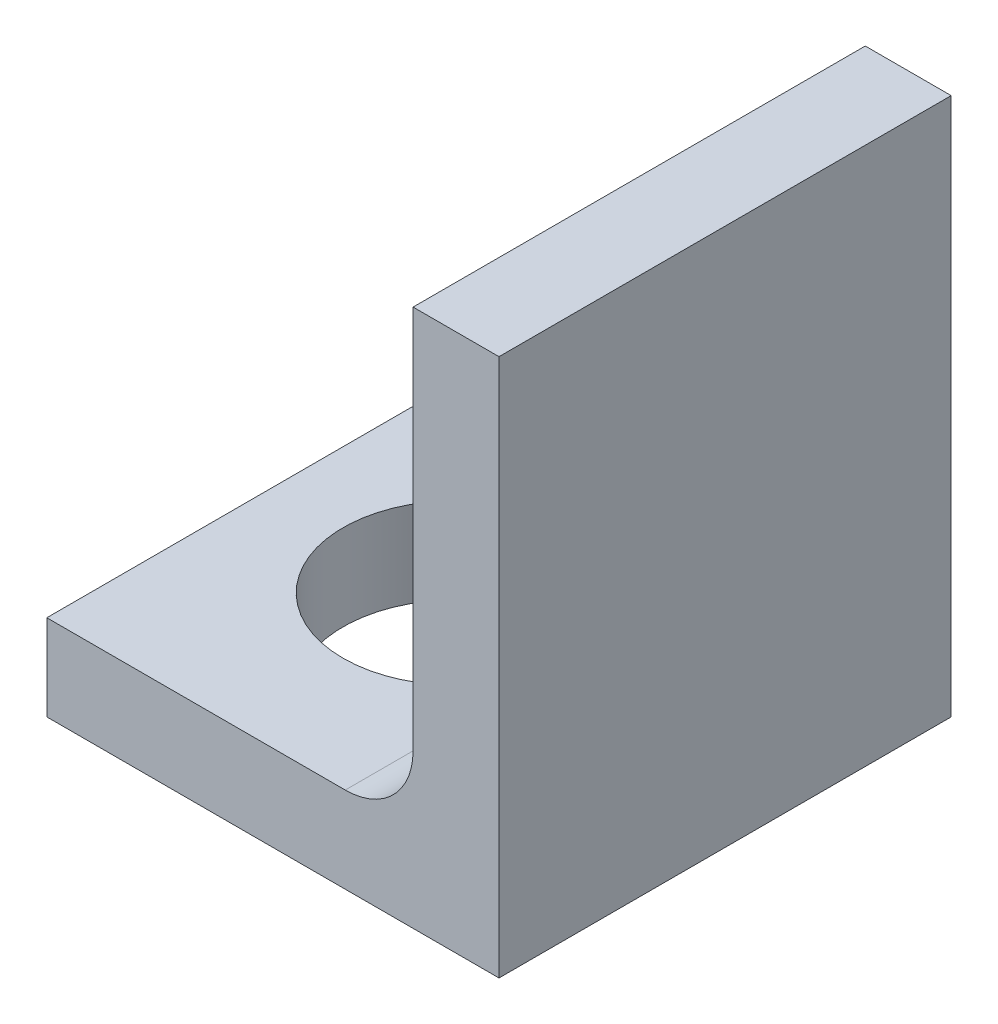
ISO-10303-21;
HEADER;
FILE_DESCRIPTION(('STEP AP214'),'2;1');
FILE_NAME('part.step','',(''),(''),'','','');
FILE_SCHEMA(('AUTOMOTIVE_DESIGN { 1 0 10303 214 1 1 1 1 }'));
ENDSEC;
DATA;
#1=APPLICATION_CONTEXT('core data for automotive mechanical design processes');
#2=APPLICATION_PROTOCOL_DEFINITION('international standard','automotive_design',2000,#1);
#3=PRODUCT_CONTEXT('',#1,'mechanical');
#4=PRODUCT('Part','Part','',(#3));
#5=PRODUCT_RELATED_PRODUCT_CATEGORY('part','',(#4));
#6=PRODUCT_DEFINITION_FORMATION('','',#4);
#7=PRODUCT_DEFINITION_CONTEXT('part definition',#1,'design');
#8=PRODUCT_DEFINITION('design','',#6,#7);
#9=PRODUCT_DEFINITION_SHAPE('','',#8);
#10=(LENGTH_UNIT() NAMED_UNIT(*) SI_UNIT(.MILLI.,.METRE.));
#11=(NAMED_UNIT(*) PLANE_ANGLE_UNIT() SI_UNIT($,.RADIAN.));
#12=(NAMED_UNIT(*) SI_UNIT($,.STERADIAN.) SOLID_ANGLE_UNIT());
#13=UNCERTAINTY_MEASURE_WITH_UNIT(LENGTH_MEASURE(1.E-05),#10,'distance_accuracy_value','');
#14=(GEOMETRIC_REPRESENTATION_CONTEXT(3) GLOBAL_UNCERTAINTY_ASSIGNED_CONTEXT((#13)) GLOBAL_UNIT_ASSIGNED_CONTEXT((#10,
#11,#12)) REPRESENTATION_CONTEXT('',''));
#15=CARTESIAN_POINT('',(0.,0.,0.));
#16=DIRECTION('',(0.,0.,1.));
#17=DIRECTION('',(1.,0.,0.));
#18=AXIS2_PLACEMENT_3D('',#15,#16,#17);
#19=CARTESIAN_POINT('',(0.,0.,20.));
#20=DIRECTION('',(0.,-1.,0.));
#21=DIRECTION('',(0.,0.,-1.));
#22=AXIS2_PLACEMENT_3D('',#19,#20,#21);
#23=PLANE('',#22);
#24=CARTESIAN_POINT('',(8.1,0.,10.));
#25=DIRECTION('',(0.,1.,0.));
#26=DIRECTION('',(0.,0.,1.));
#27=AXIS2_PLACEMENT_3D('',#24,#25,#26);
#28=CIRCLE('',#27,5.);
#29=CARTESIAN_POINT('',(8.1,0.,15.));
#30=VERTEX_POINT('',#29);
#31=EDGE_CURVE('E140',#30,#30,#28,.T.);
#32=ORIENTED_EDGE('',*,*,#31,.F.);
#33=EDGE_LOOP('',(#32));
#34=FACE_BOUND('',#33,.T.);
#35=DIRECTION('',(-1.,0.,0.));
#36=VECTOR('',#35,1.);
#37=CARTESIAN_POINT('',(0.,0.,20.));
#38=LINE('',#37,#36);
#39=CARTESIAN_POINT('',(13.2,0.,20.));
#40=VERTEX_POINT('',#39);
#41=CARTESIAN_POINT('',(0.,0.,20.));
#42=VERTEX_POINT('',#41);
#43=EDGE_CURVE('E161',#40,#42,#38,.T.);
#44=ORIENTED_EDGE('',*,*,#43,.F.);
#45=DIRECTION('',(0.,0.,1.));
#46=VECTOR('',#45,1.);
#47=CARTESIAN_POINT('',(13.2,0.,0.));
#48=LINE('',#47,#46);
#49=CARTESIAN_POINT('',(13.2,0.,0.));
#50=VERTEX_POINT('',#49);
#51=EDGE_CURVE('E70',#40,#50,#48,.F.);
#52=ORIENTED_EDGE('',*,*,#51,.T.);
#53=DIRECTION('',(-1.,0.,0.));
#54=VECTOR('',#53,1.);
#55=CARTESIAN_POINT('',(0.,0.,0.));
#56=LINE('',#55,#54);
#57=CARTESIAN_POINT('',(0.,0.,0.));
#58=VERTEX_POINT('',#57);
#59=EDGE_CURVE('E111',#50,#58,#56,.T.);
#60=ORIENTED_EDGE('',*,*,#59,.T.);
#61=DIRECTION('',(0.,0.,-1.));
#62=VECTOR('',#61,1.);
#63=CARTESIAN_POINT('',(0.,0.,20.));
#64=LINE('',#63,#62);
#65=EDGE_CURVE('E163',#42,#58,#64,.T.);
#66=ORIENTED_EDGE('',*,*,#65,.F.);
#67=EDGE_LOOP('',(#44,#52,#60,#66));
#68=FACE_BOUND('',#67,.T.);
#69=ADVANCED_FACE('F44',(#34,#68),#23,.F.);
#70=CARTESIAN_POINT('',(0.,0.,20.));
#71=DIRECTION('',(1.,0.,0.));
#72=DIRECTION('',(0.,1.,0.));
#73=AXIS2_PLACEMENT_3D('',#70,#71,#72);
#74=PLANE('',#73);
#75=DIRECTION('',(0.,-1.,0.));
#76=VECTOR('',#75,1.);
#77=CARTESIAN_POINT('',(0.,0.,0.));
#78=LINE('',#77,#76);
#79=CARTESIAN_POINT('',(0.,-3.8,0.));
#80=VERTEX_POINT('',#79);
#81=EDGE_CURVE('E147',#58,#80,#78,.T.);
#82=ORIENTED_EDGE('',*,*,#81,.T.);
#83=DIRECTION('',(0.,0.,-1.));
#84=VECTOR('',#83,1.);
#85=CARTESIAN_POINT('',(0.,-3.8,20.));
#86=LINE('',#85,#84);
#87=CARTESIAN_POINT('',(0.,-3.8,20.));
#88=VERTEX_POINT('',#87);
#89=EDGE_CURVE('E180',#88,#80,#86,.T.);
#90=ORIENTED_EDGE('',*,*,#89,.F.);
#91=DIRECTION('',(0.,-1.,0.));
#92=VECTOR('',#91,1.);
#93=CARTESIAN_POINT('',(0.,0.,20.));
#94=LINE('',#93,#92);
#95=EDGE_CURVE('E151',#42,#88,#94,.T.);
#96=ORIENTED_EDGE('',*,*,#95,.F.);
#97=ORIENTED_EDGE('',*,*,#65,.T.);
#98=EDGE_LOOP('',(#82,#90,#96,#97));
#99=FACE_BOUND('',#98,.T.);
#100=ADVANCED_FACE('F200',(#99),#74,.F.);
#101=CARTESIAN_POINT('',(0.,-3.8,20.));
#102=DIRECTION('',(0.,1.,0.));
#103=DIRECTION('',(0.,0.,1.));
#104=AXIS2_PLACEMENT_3D('',#101,#102,#103);
#105=PLANE('',#104);
#106=CARTESIAN_POINT('',(8.1,-3.8,10.));
#107=DIRECTION('',(0.,1.,0.));
#108=DIRECTION('',(0.,0.,1.));
#109=AXIS2_PLACEMENT_3D('',#106,#107,#108);
#110=CIRCLE('',#109,5.);
#111=CARTESIAN_POINT('',(8.1,-3.8,15.));
#112=VERTEX_POINT('',#111);
#113=EDGE_CURVE('E134',#112,#112,#110,.T.);
#114=ORIENTED_EDGE('',*,*,#113,.T.);
#115=EDGE_LOOP('',(#114));
#116=FACE_BOUND('',#115,.T.);
#117=DIRECTION('',(1.,0.,0.));
#118=VECTOR('',#117,1.);
#119=CARTESIAN_POINT('',(0.,-3.8,0.));
#120=LINE('',#119,#118);
#121=CARTESIAN_POINT('',(20.,-3.8,0.));
#122=VERTEX_POINT('',#121);
#123=EDGE_CURVE('E113',#80,#122,#120,.T.);
#124=ORIENTED_EDGE('',*,*,#123,.T.);
#125=DIRECTION('',(0.,0.,-1.));
#126=VECTOR('',#125,1.);
#127=CARTESIAN_POINT('',(20.,-3.8,20.));
#128=LINE('',#127,#126);
#129=CARTESIAN_POINT('',(20.,-3.8,20.));
#130=VERTEX_POINT('',#129);
#131=EDGE_CURVE('E112',#130,#122,#128,.T.);
#132=ORIENTED_EDGE('',*,*,#131,.F.);
#133=DIRECTION('',(1.,0.,0.));
#134=VECTOR('',#133,1.);
#135=CARTESIAN_POINT('',(0.,-3.8,20.));
#136=LINE('',#135,#134);
#137=EDGE_CURVE('E154',#88,#130,#136,.T.);
#138=ORIENTED_EDGE('',*,*,#137,.F.);
#139=ORIENTED_EDGE('',*,*,#89,.T.);
#140=EDGE_LOOP('',(#124,#132,#138,#139));
#141=FACE_BOUND('',#140,.T.);
#142=ADVANCED_FACE('F197',(#116,#141),#105,.F.);
#143=CARTESIAN_POINT('',(20.,0.,20.));
#144=DIRECTION('',(-1.,0.,0.));
#145=DIRECTION('',(0.,0.,1.));
#146=AXIS2_PLACEMENT_3D('',#143,#144,#145);
#147=PLANE('',#146);
#148=DIRECTION('',(0.,1.,0.));
#149=VECTOR('',#148,1.);
#150=CARTESIAN_POINT('',(20.,0.,0.));
#151=LINE('',#150,#149);
#152=CARTESIAN_POINT('',(20.,20.,0.));
#153=VERTEX_POINT('',#152);
#154=EDGE_CURVE('E102',#122,#153,#151,.T.);
#155=ORIENTED_EDGE('',*,*,#154,.T.);
#156=DIRECTION('',(0.,0.,-1.));
#157=VECTOR('',#156,1.);
#158=CARTESIAN_POINT('',(20.,20.,0.));
#159=LINE('',#158,#157);
#160=CARTESIAN_POINT('',(20.,20.,20.));
#161=VERTEX_POINT('',#160);
#162=EDGE_CURVE('E108',#161,#153,#159,.T.);
#163=ORIENTED_EDGE('',*,*,#162,.F.);
#164=DIRECTION('',(0.,1.,0.));
#165=VECTOR('',#164,1.);
#166=CARTESIAN_POINT('',(20.,0.,20.));
#167=LINE('',#166,#165);
#168=EDGE_CURVE('E158',#130,#161,#167,.T.);
#169=ORIENTED_EDGE('',*,*,#168,.F.);
#170=ORIENTED_EDGE('',*,*,#131,.T.);
#171=EDGE_LOOP('',(#155,#163,#169,#170));
#172=FACE_BOUND('',#171,.T.);
#173=ADVANCED_FACE('F106',(#172),#147,.F.);
#174=CARTESIAN_POINT('',(0.,0.,20.));
#175=DIRECTION('',(0.,0.,1.));
#176=DIRECTION('',(1.,0.,0.));
#177=AXIS2_PLACEMENT_3D('',#174,#175,#176);
#178=PLANE('',#177);
#179=ORIENTED_EDGE('',*,*,#95,.T.);
#180=ORIENTED_EDGE('',*,*,#137,.T.);
#181=ORIENTED_EDGE('',*,*,#168,.T.);
#182=DIRECTION('',(1.,0.,0.));
#183=VECTOR('',#182,1.);
#184=CARTESIAN_POINT('',(20.,20.,20.));
#185=LINE('',#184,#183);
#186=CARTESIAN_POINT('',(16.2,20.,20.));
#187=VERTEX_POINT('',#186);
#188=EDGE_CURVE('E131',#187,#161,#185,.T.);
#189=ORIENTED_EDGE('',*,*,#188,.F.);
#190=DIRECTION('',(0.,-1.,0.));
#191=VECTOR('',#190,1.);
#192=CARTESIAN_POINT('',(16.2,20.,20.));
#193=LINE('',#192,#191);
#194=CARTESIAN_POINT('',(16.2,3.,20.));
#195=VERTEX_POINT('',#194);
#196=EDGE_CURVE('E144',#187,#195,#193,.T.);
#197=ORIENTED_EDGE('',*,*,#196,.T.);
#198=CARTESIAN_POINT('',(13.2,3.,20.));
#199=DIRECTION('',(0.,0.,1.));
#200=DIRECTION('',(1.,0.,0.));
#201=AXIS2_PLACEMENT_3D('',#198,#199,#200);
#202=CIRCLE('',#201,3.);
#203=EDGE_CURVE('E53',#195,#40,#202,.F.);
#204=ORIENTED_EDGE('',*,*,#203,.T.);
#205=ORIENTED_EDGE('',*,*,#43,.T.);
#206=EDGE_LOOP('',(#179,#180,#181,#189,#197,#204,#205));
#207=FACE_BOUND('',#206,.T.);
#208=ADVANCED_FACE('F193',(#207),#178,.T.);
#209=CARTESIAN_POINT('',(0.,0.,0.));
#210=DIRECTION('',(0.,0.,1.));
#211=DIRECTION('',(1.,0.,0.));
#212=AXIS2_PLACEMENT_3D('',#209,#210,#211);
#213=PLANE('',#212);
#214=ORIENTED_EDGE('',*,*,#81,.F.);
#215=ORIENTED_EDGE('',*,*,#59,.F.);
#216=CARTESIAN_POINT('',(13.2,3.,0.));
#217=DIRECTION('',(0.,0.,1.));
#218=DIRECTION('',(1.,0.,0.));
#219=AXIS2_PLACEMENT_3D('',#216,#217,#218);
#220=CIRCLE('',#219,3.);
#221=CARTESIAN_POINT('',(16.2,3.,0.));
#222=VERTEX_POINT('',#221);
#223=EDGE_CURVE('E11',#50,#222,#220,.T.);
#224=ORIENTED_EDGE('',*,*,#223,.T.);
#225=DIRECTION('',(0.,-1.,0.));
#226=VECTOR('',#225,1.);
#227=CARTESIAN_POINT('',(16.2,20.,0.));
#228=LINE('',#227,#226);
#229=CARTESIAN_POINT('',(16.2,20.,0.));
#230=VERTEX_POINT('',#229);
#231=EDGE_CURVE('E125',#230,#222,#228,.T.);
#232=ORIENTED_EDGE('',*,*,#231,.F.);
#233=DIRECTION('',(-1.,0.,0.));
#234=VECTOR('',#233,1.);
#235=CARTESIAN_POINT('',(20.,20.,0.));
#236=LINE('',#235,#234);
#237=EDGE_CURVE('E119',#153,#230,#236,.T.);
#238=ORIENTED_EDGE('',*,*,#237,.F.);
#239=ORIENTED_EDGE('',*,*,#154,.F.);
#240=ORIENTED_EDGE('',*,*,#123,.F.);
#241=EDGE_LOOP('',(#214,#215,#224,#232,#238,#239,#240));
#242=FACE_BOUND('',#241,.T.);
#243=ADVANCED_FACE('F120',(#242),#213,.F.);
#244=CARTESIAN_POINT('',(16.2,20.,0.));
#245=DIRECTION('',(1.,0.,0.));
#246=DIRECTION('',(0.,0.,-1.));
#247=AXIS2_PLACEMENT_3D('',#244,#245,#246);
#248=PLANE('',#247);
#249=ORIENTED_EDGE('',*,*,#231,.T.);
#250=DIRECTION('',(0.,0.,1.));
#251=VECTOR('',#250,1.);
#252=CARTESIAN_POINT('',(16.2,3.,20.));
#253=LINE('',#252,#251);
#254=EDGE_CURVE('E176',#222,#195,#253,.T.);
#255=ORIENTED_EDGE('',*,*,#254,.T.);
#256=ORIENTED_EDGE('',*,*,#196,.F.);
#257=DIRECTION('',(0.,0.,1.));
#258=VECTOR('',#257,1.);
#259=CARTESIAN_POINT('',(16.2,20.,0.));
#260=LINE('',#259,#258);
#261=EDGE_CURVE('E127',#230,#187,#260,.T.);
#262=ORIENTED_EDGE('',*,*,#261,.F.);
#263=EDGE_LOOP('',(#249,#255,#256,#262));
#264=FACE_BOUND('',#263,.T.);
#265=ADVANCED_FACE('F190',(#264),#248,.F.);
#266=CARTESIAN_POINT('',(0.,20.,0.));
#267=DIRECTION('',(0.,-1.,0.));
#268=DIRECTION('',(0.,0.,-1.));
#269=AXIS2_PLACEMENT_3D('',#266,#267,#268);
#270=PLANE('',#269);
#271=ORIENTED_EDGE('',*,*,#162,.T.);
#272=ORIENTED_EDGE('',*,*,#237,.T.);
#273=ORIENTED_EDGE('',*,*,#261,.T.);
#274=ORIENTED_EDGE('',*,*,#188,.T.);
#275=EDGE_LOOP('',(#271,#272,#273,#274));
#276=FACE_BOUND('',#275,.T.);
#277=ADVANCED_FACE('F129',(#276),#270,.F.);
#278=CARTESIAN_POINT('',(8.1,-30.,10.));
#279=DIRECTION('',(0.,1.,0.));
#280=DIRECTION('',(0.,0.,1.));
#281=AXIS2_PLACEMENT_3D('',#278,#279,#280);
#282=CYLINDRICAL_SURFACE('',#281,5.);
#283=ORIENTED_EDGE('',*,*,#31,.T.);
#284=EDGE_LOOP('',(#283));
#285=FACE_BOUND('',#284,.T.);
#286=ORIENTED_EDGE('',*,*,#113,.F.);
#287=EDGE_LOOP('',(#286));
#288=FACE_BOUND('',#287,.T.);
#289=ADVANCED_FACE('F205',(#285,#288),#282,.F.);
#290=CARTESIAN_POINT('',(13.2,3.,0.));
#291=DIRECTION('',(0.,0.,-1.));
#292=DIRECTION('',(-1.,0.,0.));
#293=AXIS2_PLACEMENT_3D('',#290,#291,#292);
#294=CYLINDRICAL_SURFACE('',#293,3.);
#295=ORIENTED_EDGE('',*,*,#223,.F.);
#296=ORIENTED_EDGE('',*,*,#51,.F.);
#297=ORIENTED_EDGE('',*,*,#203,.F.);
#298=ORIENTED_EDGE('',*,*,#254,.F.);
#299=EDGE_LOOP('',(#295,#296,#297,#298));
#300=FACE_BOUND('',#299,.T.);
#301=ADVANCED_FACE('F50',(#300),#294,.F.);
#302=CLOSED_SHELL('',(#69,#100,#142,#173,#208,#243,#265,#277,#289,#301));
#303=MANIFOLD_SOLID_BREP('B2',#302);
#304=ADVANCED_BREP_SHAPE_REPRESENTATION('',(#18,#303),#14);
#305=SHAPE_DEFINITION_REPRESENTATION(#9,#304);
ENDSEC;
END-ISO-10303-21;
